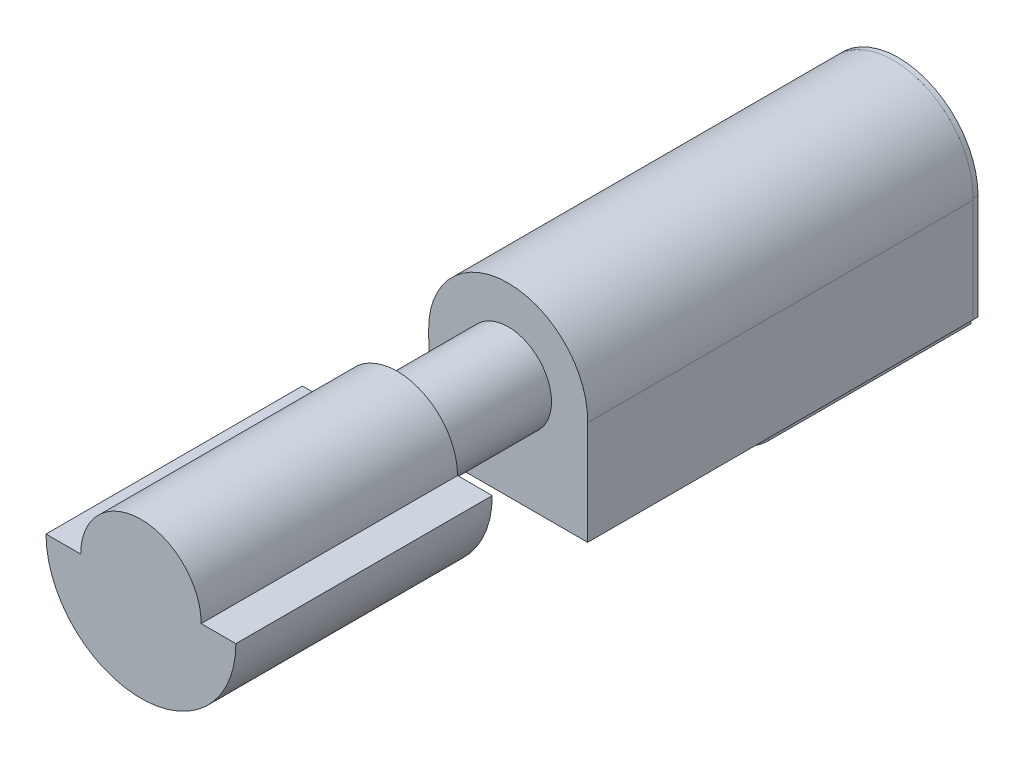
ISO-10303-21;
HEADER;
FILE_DESCRIPTION(('STEP AP214'),'2;1');
FILE_NAME('part.step','',(''),(''),'','','');
FILE_SCHEMA(('AUTOMOTIVE_DESIGN { 1 0 10303 214 1 1 1 1 }'));
ENDSEC;
DATA;
#1=APPLICATION_CONTEXT('core data for automotive mechanical design processes');
#2=APPLICATION_PROTOCOL_DEFINITION('international standard','automotive_design',2000,#1);
#3=PRODUCT_CONTEXT('',#1,'mechanical');
#4=PRODUCT('Part','Part','',(#3));
#5=PRODUCT_RELATED_PRODUCT_CATEGORY('part','',(#4));
#6=PRODUCT_DEFINITION_FORMATION('','',#4);
#7=PRODUCT_DEFINITION_CONTEXT('part definition',#1,'design');
#8=PRODUCT_DEFINITION('design','',#6,#7);
#9=PRODUCT_DEFINITION_SHAPE('','',#8);
#10=(LENGTH_UNIT() NAMED_UNIT(*) SI_UNIT(.MILLI.,.METRE.));
#11=(NAMED_UNIT(*) PLANE_ANGLE_UNIT() SI_UNIT($,.RADIAN.));
#12=(NAMED_UNIT(*) SI_UNIT($,.STERADIAN.) SOLID_ANGLE_UNIT());
#13=UNCERTAINTY_MEASURE_WITH_UNIT(LENGTH_MEASURE(1.E-05),#10,'distance_accuracy_value','');
#14=(GEOMETRIC_REPRESENTATION_CONTEXT(3) GLOBAL_UNCERTAINTY_ASSIGNED_CONTEXT((#13)) GLOBAL_UNIT_ASSIGNED_CONTEXT((#10,
#11,#12)) REPRESENTATION_CONTEXT('',''));
#15=CARTESIAN_POINT('',(0.,0.,0.));
#16=DIRECTION('',(0.,0.,1.));
#17=DIRECTION('',(1.,0.,0.));
#18=AXIS2_PLACEMENT_3D('',#15,#16,#17);
#19=CARTESIAN_POINT('',(0.,0.,0.));
#20=DIRECTION('',(0.,0.,1.));
#21=DIRECTION('',(1.,0.,0.));
#22=AXIS2_PLACEMENT_3D('',#19,#20,#21);
#23=PLANE('',#22);
#24=DIRECTION('',(-1.,0.,0.));
#25=VECTOR('',#24,1.);
#26=CARTESIAN_POINT('',(1.25,-2.15049334737199,0.));
#27=LINE('',#26,#25);
#28=CARTESIAN_POINT('',(1.6,-2.15049334737199,0.));
#29=VERTEX_POINT('',#28);
#30=CARTESIAN_POINT('',(1.25,-2.15049334737199,0.));
#31=VERTEX_POINT('',#30);
#32=EDGE_CURVE('E11',#29,#31,#27,.T.);
#33=ORIENTED_EDGE('',*,*,#32,.F.);
#34=DIRECTION('',(0.,-1.,0.));
#35=VECTOR('',#34,1.);
#36=CARTESIAN_POINT('',(1.6,-2.15049334737199,0.));
#37=LINE('',#36,#35);
#38=CARTESIAN_POINT('',(1.6,-2.25049334737199,0.));
#39=VERTEX_POINT('',#38);
#40=EDGE_CURVE('E430',#29,#39,#37,.T.);
#41=ORIENTED_EDGE('',*,*,#40,.T.);
#42=DIRECTION('',(1.,0.,0.));
#43=VECTOR('',#42,1.);
#44=CARTESIAN_POINT('',(1.6,-2.25049334737199,0.));
#45=LINE('',#44,#43);
#46=CARTESIAN_POINT('',(0.300000000000001,-2.25049334737199,0.));
#47=VERTEX_POINT('',#46);
#48=EDGE_CURVE('E876',#47,#39,#45,.T.);
#49=ORIENTED_EDGE('',*,*,#48,.F.);
#50=DIRECTION('',(0.,1.,0.));
#51=VECTOR('',#50,1.);
#52=CARTESIAN_POINT('',(0.300000000000001,-2.25049334737199,0.));
#53=LINE('',#52,#51);
#54=CARTESIAN_POINT('',(0.300000000000001,-2.15049334737199,0.));
#55=VERTEX_POINT('',#54);
#56=EDGE_CURVE('E880',#47,#55,#53,.T.);
#57=ORIENTED_EDGE('',*,*,#56,.T.);
#58=DIRECTION('',(-1.,0.,0.));
#59=VECTOR('',#58,1.);
#60=CARTESIAN_POINT('',(1.6,-2.15049334737199,0.));
#61=LINE('',#60,#59);
#62=CARTESIAN_POINT('',(-0.300000000000001,-2.15049334737199,0.));
#63=VERTEX_POINT('',#62);
#64=EDGE_CURVE('E422',#55,#63,#61,.T.);
#65=ORIENTED_EDGE('',*,*,#64,.T.);
#66=DIRECTION('',(0.,1.,0.));
#67=VECTOR('',#66,1.);
#68=CARTESIAN_POINT('',(-0.300000000000001,-2.25049334737199,0.));
#69=LINE('',#68,#67);
#70=CARTESIAN_POINT('',(-0.300000000000001,-2.25049334737199,0.));
#71=VERTEX_POINT('',#70);
#72=EDGE_CURVE('E854',#71,#63,#69,.T.);
#73=ORIENTED_EDGE('',*,*,#72,.F.);
#74=DIRECTION('',(1.,0.,0.));
#75=VECTOR('',#74,1.);
#76=CARTESIAN_POINT('',(-1.6,-2.25049334737199,0.));
#77=LINE('',#76,#75);
#78=CARTESIAN_POINT('',(-1.6,-2.25049334737199,0.));
#79=VERTEX_POINT('',#78);
#80=EDGE_CURVE('E415',#79,#71,#77,.T.);
#81=ORIENTED_EDGE('',*,*,#80,.F.);
#82=DIRECTION('',(0.,1.,0.));
#83=VECTOR('',#82,1.);
#84=CARTESIAN_POINT('',(-1.6,-2.15049334737199,0.));
#85=LINE('',#84,#83);
#86=CARTESIAN_POINT('',(-1.6,-2.15049334737199,0.));
#87=VERTEX_POINT('',#86);
#88=EDGE_CURVE('E413',#79,#87,#85,.T.);
#89=ORIENTED_EDGE('',*,*,#88,.T.);
#90=DIRECTION('',(-1.,0.,0.));
#91=VECTOR('',#90,1.);
#92=CARTESIAN_POINT('',(-1.6,-2.15049334737199,0.));
#93=LINE('',#92,#91);
#94=CARTESIAN_POINT('',(-1.25,-2.15049334737199,0.));
#95=VERTEX_POINT('',#94);
#96=EDGE_CURVE('E334',#95,#87,#93,.T.);
#97=ORIENTED_EDGE('',*,*,#96,.F.);
#98=DIRECTION('',(0.,-1.,0.));
#99=VECTOR('',#98,1.);
#100=CARTESIAN_POINT('',(-1.25,-2.15049334737199,0.));
#101=LINE('',#100,#99);
#102=CARTESIAN_POINT('',(-1.25,0.,0.));
#103=VERTEX_POINT('',#102);
#104=EDGE_CURVE('E405',#103,#95,#101,.T.);
#105=ORIENTED_EDGE('',*,*,#104,.F.);
#106=CARTESIAN_POINT('',(0.,0.,0.));
#107=DIRECTION('',(0.,0.,1.));
#108=DIRECTION('',(-1.,0.,0.));
#109=AXIS2_PLACEMENT_3D('',#106,#107,#108);
#110=CIRCLE('',#109,1.25);
#111=CARTESIAN_POINT('',(1.25,0.,0.));
#112=VERTEX_POINT('',#111);
#113=EDGE_CURVE('E64',#112,#103,#110,.T.);
#114=ORIENTED_EDGE('',*,*,#113,.F.);
#115=DIRECTION('',(0.,1.,0.));
#116=VECTOR('',#115,1.);
#117=CARTESIAN_POINT('',(1.25,0.,0.));
#118=LINE('',#117,#116);
#119=EDGE_CURVE('E60',#31,#112,#118,.T.);
#120=ORIENTED_EDGE('',*,*,#119,.F.);
#121=EDGE_LOOP('',(#33,#41,#49,#57,#65,#73,#81,#89,#97,#105,#114,#120));
#122=FACE_BOUND('',#121,.T.);
#123=ADVANCED_FACE('F41',(#122),#23,.F.);
#124=DIRECTION('',(-0.0232441969275777,0.999729817155211,0.));
#125=VECTOR('',#124,1.);
#126=CARTESIAN_POINT('',(-1.65,0.,0.));
#127=LINE('',#126,#125);
#128=CARTESIAN_POINT('',(-1.65,0.,0.));
#129=VERTEX_POINT('',#128);
#130=EDGE_CURVE('E328',#87,#129,#127,.T.);
#131=ORIENTED_EDGE('',*,*,#130,.F.);
#132=DIRECTION('',(-1.,0.,0.));
#133=VECTOR('',#132,1.);
#134=CARTESIAN_POINT('',(-1.61,-2.15049334737199,0.));
#135=LINE('',#134,#133);
#136=CARTESIAN_POINT('',(-1.61,-2.15049334737199,0.));
#137=VERTEX_POINT('',#136);
#138=EDGE_CURVE('E263',#87,#137,#135,.T.);
#139=ORIENTED_EDGE('',*,*,#138,.T.);
#140=DIRECTION('',(-0.0185971662543572,0.999827057749143,0.));
#141=VECTOR('',#140,1.);
#142=CARTESIAN_POINT('',(-1.61,-2.15049334737199,0.));
#143=LINE('',#142,#141);
#144=CARTESIAN_POINT('',(-1.64885867984412,-0.0613600350612654,0.));
#145=VERTEX_POINT('',#144);
#146=EDGE_CURVE('E266',#137,#145,#143,.T.);
#147=ORIENTED_EDGE('',*,*,#146,.T.);
#148=CARTESIAN_POINT('',(0.,0.,0.));
#149=DIRECTION('',(0.,0.,1.));
#150=DIRECTION('',(-1.,0.,0.));
#151=AXIS2_PLACEMENT_3D('',#148,#149,#150);
#152=CIRCLE('',#151,1.65);
#153=EDGE_CURVE('E427',#129,#145,#152,.T.);
#154=ORIENTED_EDGE('',*,*,#153,.F.);
#155=EDGE_LOOP('',(#131,#139,#147,#154));
#156=FACE_BOUND('',#155,.T.);
#157=ADVANCED_FACE('F450',(#156),#23,.F.);
#158=CARTESIAN_POINT('',(0.,0.,8.));
#159=DIRECTION('',(0.,0.,1.));
#160=DIRECTION('',(1.,0.,0.));
#161=AXIS2_PLACEMENT_3D('',#158,#159,#160);
#162=PLANE('',#161);
#163=CARTESIAN_POINT('',(0.,0.,8.));
#164=DIRECTION('',(0.,0.,1.));
#165=DIRECTION('',(1.,0.,0.));
#166=AXIS2_PLACEMENT_3D('',#163,#164,#165);
#167=CIRCLE('',#166,0.9);
#168=CARTESIAN_POINT('',(0.9,0.,8.));
#169=VERTEX_POINT('',#168);
#170=EDGE_CURVE('E421',#169,#169,#167,.T.);
#171=ORIENTED_EDGE('',*,*,#170,.F.);
#172=EDGE_LOOP('',(#171));
#173=FACE_BOUND('',#172,.T.);
#174=DIRECTION('',(0.,-1.,0.));
#175=VECTOR('',#174,1.);
#176=CARTESIAN_POINT('',(1.65,0.,8.));
#177=LINE('',#176,#175);
#178=CARTESIAN_POINT('',(1.65,0.,8.));
#179=VERTEX_POINT('',#178);
#180=CARTESIAN_POINT('',(1.65,-2.15049334737199,8.));
#181=VERTEX_POINT('',#180);
#182=EDGE_CURVE('E271',#179,#181,#177,.T.);
#183=ORIENTED_EDGE('',*,*,#182,.F.);
#184=CARTESIAN_POINT('',(0.,0.0361001669217735,8.));
#185=DIRECTION('',(0.,0.,1.));
#186=DIRECTION('',(1.,0.,0.));
#187=AXIS2_PLACEMENT_3D('',#184,#185,#186);
#188=CIRCLE('',#187,1.65039486852443);
#189=CARTESIAN_POINT('',(-1.65,0.,8.));
#190=VERTEX_POINT('',#189);
#191=EDGE_CURVE('E291',#190,#179,#188,.F.);
#192=ORIENTED_EDGE('',*,*,#191,.F.);
#193=CARTESIAN_POINT('',(-1.65,0.,8.));
#194=DIRECTION('',(0.0185971662543562,-0.999827057749143,0.));
#195=VECTOR('',#194,1.);
#196=LINE('',#193,#195);
#197=CARTESIAN_POINT('',(-1.64885867984412,-0.0613600350612645,8.));
#198=VERTEX_POINT('',#197);
#199=EDGE_CURVE('E52',#190,#198,#196,.T.);
#200=ORIENTED_EDGE('',*,*,#199,.T.);
#201=DIRECTION('',(-0.0185971662543572,0.999827057749143,0.));
#202=VECTOR('',#201,1.);
#203=CARTESIAN_POINT('',(-1.61,-2.15049334737199,8.));
#204=LINE('',#203,#202);
#205=CARTESIAN_POINT('',(-1.61,-2.15049334737199,8.));
#206=VERTEX_POINT('',#205);
#207=EDGE_CURVE('E284',#206,#198,#204,.T.);
#208=ORIENTED_EDGE('',*,*,#207,.F.);
#209=DIRECTION('',(-1.,0.,0.));
#210=VECTOR('',#209,1.);
#211=CARTESIAN_POINT('',(-1.61,-2.15049334737199,8.));
#212=LINE('',#211,#210);
#213=EDGE_CURVE('E276',#181,#206,#212,.T.);
#214=ORIENTED_EDGE('',*,*,#213,.F.);
#215=EDGE_LOOP('',(#183,#192,#200,#208,#214));
#216=FACE_BOUND('',#215,.T.);
#217=ADVANCED_FACE('F451',(#173,#216),#162,.T.);
#218=CARTESIAN_POINT('',(0.,0.,8.));
#219=DIRECTION('',(0.,0.,-1.));
#220=DIRECTION('',(-1.,0.,0.));
#221=AXIS2_PLACEMENT_3D('',#218,#219,#220);
#222=CYLINDRICAL_SURFACE('',#221,1.65);
#223=ORIENTED_EDGE('',*,*,#153,.T.);
#224=DIRECTION('',(0.,0.,-1.));
#225=VECTOR('',#224,1.);
#226=CARTESIAN_POINT('',(-1.64885867984412,-0.0613600350612513,8.));
#227=LINE('',#226,#225);
#228=EDGE_CURVE('E298',#145,#198,#227,.F.);
#229=ORIENTED_EDGE('',*,*,#228,.T.);
#230=ORIENTED_EDGE('',*,*,#199,.F.);
#231=DIRECTION('',(0.,0.,-1.));
#232=VECTOR('',#231,1.);
#233=CARTESIAN_POINT('',(-1.65,0.,13.0613923714813));
#234=LINE('',#233,#232);
#235=EDGE_CURVE('E310',#190,#129,#234,.T.);
#236=ORIENTED_EDGE('',*,*,#235,.T.);
#237=EDGE_LOOP('',(#223,#229,#230,#236));
#238=FACE_BOUND('',#237,.T.);
#239=ADVANCED_FACE('F43',(#238),#222,.T.);
#240=CARTESIAN_POINT('',(1.6,-2.15049334737199,4.2));
#241=DIRECTION('',(1.,0.,0.));
#242=DIRECTION('',(0.,0.,-1.));
#243=AXIS2_PLACEMENT_3D('',#240,#241,#242);
#244=PLANE('',#243);
#245=DIRECTION('',(0.,0.,-1.));
#246=VECTOR('',#245,1.);
#247=CARTESIAN_POINT('',(1.6,-2.15049334737199,4.2));
#248=LINE('',#247,#246);
#249=CARTESIAN_POINT('',(1.6,-2.15049334737199,4.2));
#250=VERTEX_POINT('',#249);
#251=EDGE_CURVE('E290',#250,#29,#248,.T.);
#252=ORIENTED_EDGE('',*,*,#251,.F.);
#253=DIRECTION('',(0.,1.,0.));
#254=VECTOR('',#253,1.);
#255=CARTESIAN_POINT('',(1.6,-2.25049334737199,4.2));
#256=LINE('',#255,#254);
#257=CARTESIAN_POINT('',(1.6,-2.25049334737199,4.2));
#258=VERTEX_POINT('',#257);
#259=EDGE_CURVE('E910',#258,#250,#256,.T.);
#260=ORIENTED_EDGE('',*,*,#259,.F.);
#261=DIRECTION('',(0.,0.,1.));
#262=VECTOR('',#261,1.);
#263=CARTESIAN_POINT('',(1.6,-2.25049334737199,0.));
#264=LINE('',#263,#262);
#265=EDGE_CURVE('E859',#39,#258,#264,.T.);
#266=ORIENTED_EDGE('',*,*,#265,.F.);
#267=ORIENTED_EDGE('',*,*,#40,.F.);
#268=EDGE_LOOP('',(#252,#260,#266,#267));
#269=FACE_BOUND('',#268,.T.);
#270=ADVANCED_FACE('F456',(#269),#244,.T.);
#271=CARTESIAN_POINT('',(-1.6,-2.15049334737199,4.2));
#272=DIRECTION('',(-1.,0.,0.));
#273=DIRECTION('',(0.,0.,1.));
#274=AXIS2_PLACEMENT_3D('',#271,#272,#273);
#275=PLANE('',#274);
#276=DIRECTION('',(0.,0.,1.));
#277=VECTOR('',#276,1.);
#278=CARTESIAN_POINT('',(-1.6,-2.15049334737199,4.2));
#279=LINE('',#278,#277);
#280=CARTESIAN_POINT('',(-1.6,-2.15049334737199,4.2));
#281=VERTEX_POINT('',#280);
#282=EDGE_CURVE('E295',#87,#281,#279,.T.);
#283=ORIENTED_EDGE('',*,*,#282,.F.);
#284=ORIENTED_EDGE('',*,*,#88,.F.);
#285=DIRECTION('',(0.,0.,-1.));
#286=VECTOR('',#285,1.);
#287=CARTESIAN_POINT('',(-1.6,-2.25049334737199,0.));
#288=LINE('',#287,#286);
#289=CARTESIAN_POINT('',(-1.6,-2.25049334737199,4.2));
#290=VERTEX_POINT('',#289);
#291=EDGE_CURVE('E830',#290,#79,#288,.T.);
#292=ORIENTED_EDGE('',*,*,#291,.F.);
#293=DIRECTION('',(0.,1.,0.));
#294=VECTOR('',#293,1.);
#295=CARTESIAN_POINT('',(-1.6,-2.25049334737199,4.2));
#296=LINE('',#295,#294);
#297=EDGE_CURVE('E829',#290,#281,#296,.T.);
#298=ORIENTED_EDGE('',*,*,#297,.T.);
#299=EDGE_LOOP('',(#283,#284,#292,#298));
#300=FACE_BOUND('',#299,.T.);
#301=ADVANCED_FACE('F564',(#300),#275,.T.);
#302=CARTESIAN_POINT('',(1.6,-2.15049334737199,4.2));
#303=DIRECTION('',(0.,-1.,0.));
#304=DIRECTION('',(0.,0.,-1.));
#305=AXIS2_PLACEMENT_3D('',#302,#303,#304);
#306=PLANE('',#305);
#307=DIRECTION('',(0.,0.,-1.));
#308=VECTOR('',#307,1.);
#309=CARTESIAN_POINT('',(0.300000000000001,-2.15049334737199,0.));
#310=LINE('',#309,#308);
#311=CARTESIAN_POINT('',(0.300000000000001,-2.15049334737199,4.2));
#312=VERTEX_POINT('',#311);
#313=EDGE_CURVE('E864',#312,#55,#310,.T.);
#314=ORIENTED_EDGE('',*,*,#313,.F.);
#315=CARTESIAN_POINT('',(0.8,-2.15049334737199,4.2));
#316=DIRECTION('',(0.,-1.,0.));
#317=DIRECTION('',(0.,0.,-1.));
#318=AXIS2_PLACEMENT_3D('',#315,#316,#317);
#319=CIRCLE('',#318,0.5);
#320=CARTESIAN_POINT('',(0.800000000000004,-2.15049334737199,4.7));
#321=VERTEX_POINT('',#320);
#322=EDGE_CURVE('E888',#321,#312,#319,.T.);
#323=ORIENTED_EDGE('',*,*,#322,.F.);
#324=DIRECTION('',(-1.,0.,0.));
#325=VECTOR('',#324,1.);
#326=CARTESIAN_POINT('',(1.1,-2.15049334737199,4.7));
#327=LINE('',#326,#325);
#328=CARTESIAN_POINT('',(1.1,-2.15049334737199,4.7));
#329=VERTEX_POINT('',#328);
#330=EDGE_CURVE('E884',#329,#321,#327,.T.);
#331=ORIENTED_EDGE('',*,*,#330,.F.);
#332=CARTESIAN_POINT('',(1.1,-2.15049334737199,4.2));
#333=DIRECTION('',(0.,-1.,0.));
#334=DIRECTION('',(0.,0.,-1.));
#335=AXIS2_PLACEMENT_3D('',#332,#333,#334);
#336=CIRCLE('',#335,0.5);
#337=EDGE_CURVE('E858',#250,#329,#336,.T.);
#338=ORIENTED_EDGE('',*,*,#337,.F.);
#339=ORIENTED_EDGE('',*,*,#251,.T.);
#340=ORIENTED_EDGE('',*,*,#32,.T.);
#341=DIRECTION('',(0.,0.,1.));
#342=VECTOR('',#341,1.);
#343=CARTESIAN_POINT('',(1.25,-2.15049334737199,-0.1));
#344=LINE('',#343,#342);
#345=CARTESIAN_POINT('',(1.25,-2.15049334737199,-0.1));
#346=VERTEX_POINT('',#345);
#347=EDGE_CURVE('E351',#346,#31,#344,.T.);
#348=ORIENTED_EDGE('',*,*,#347,.F.);
#349=DIRECTION('',(-1.,0.,0.));
#350=VECTOR('',#349,1.);
#351=CARTESIAN_POINT('',(1.25,-2.15049334737199,-0.1));
#352=LINE('',#351,#350);
#353=CARTESIAN_POINT('',(1.65,-2.15049334737199,-0.1));
#354=VERTEX_POINT('',#353);
#355=EDGE_CURVE('E394',#354,#346,#352,.T.);
#356=ORIENTED_EDGE('',*,*,#355,.F.);
#357=DIRECTION('',(0.,0.,1.));
#358=VECTOR('',#357,1.);
#359=CARTESIAN_POINT('',(1.65,-2.15049334737199,-0.1));
#360=LINE('',#359,#358);
#361=CARTESIAN_POINT('',(1.65,-2.15049334737199,0.));
#362=VERTEX_POINT('',#361);
#363=EDGE_CURVE('E355',#354,#362,#360,.T.);
#364=ORIENTED_EDGE('',*,*,#363,.T.);
#365=DIRECTION('',(0.,0.,-1.));
#366=VECTOR('',#365,1.);
#367=CARTESIAN_POINT('',(1.65,-2.15049334737199,13.0613923714813));
#368=LINE('',#367,#366);
#369=EDGE_CURVE('E275',#181,#362,#368,.T.);
#370=ORIENTED_EDGE('',*,*,#369,.F.);
#371=ORIENTED_EDGE('',*,*,#213,.T.);
#372=DIRECTION('',(0.,0.,-1.));
#373=VECTOR('',#372,1.);
#374=CARTESIAN_POINT('',(-1.61,-2.15049334737199,13.0613923714813));
#375=LINE('',#374,#373);
#376=EDGE_CURVE('E280',#206,#137,#375,.T.);
#377=ORIENTED_EDGE('',*,*,#376,.T.);
#378=ORIENTED_EDGE('',*,*,#138,.F.);
#379=ORIENTED_EDGE('',*,*,#282,.T.);
#380=CARTESIAN_POINT('',(-1.1,-2.15049334737199,4.2));
#381=DIRECTION('',(0.,-1.,0.));
#382=DIRECTION('',(0.,0.,1.));
#383=AXIS2_PLACEMENT_3D('',#380,#381,#382);
#384=CIRCLE('',#383,0.5);
#385=CARTESIAN_POINT('',(-1.1,-2.15049334737199,4.7));
#386=VERTEX_POINT('',#385);
#387=EDGE_CURVE('E844',#386,#281,#384,.T.);
#388=ORIENTED_EDGE('',*,*,#387,.F.);
#389=DIRECTION('',(-1.,0.,0.));
#390=VECTOR('',#389,1.);
#391=CARTESIAN_POINT('',(-1.1,-2.15049334737199,4.7));
#392=LINE('',#391,#390);
#393=CARTESIAN_POINT('',(-0.800000000000004,-2.15049334737199,4.7));
#394=VERTEX_POINT('',#393);
#395=EDGE_CURVE('E995',#394,#386,#392,.T.);
#396=ORIENTED_EDGE('',*,*,#395,.F.);
#397=CARTESIAN_POINT('',(-0.8,-2.15049334737199,4.2));
#398=DIRECTION('',(0.,-1.,0.));
#399=DIRECTION('',(0.,0.,1.));
#400=AXIS2_PLACEMENT_3D('',#397,#398,#399);
#401=CIRCLE('',#400,0.5);
#402=CARTESIAN_POINT('',(-0.300000000000001,-2.15049334737199,4.2));
#403=VERTEX_POINT('',#402);
#404=EDGE_CURVE('E992',#403,#394,#401,.T.);
#405=ORIENTED_EDGE('',*,*,#404,.F.);
#406=DIRECTION('',(0.,0.,1.));
#407=VECTOR('',#406,1.);
#408=CARTESIAN_POINT('',(-0.300000000000001,-2.15049334737199,0.));
#409=LINE('',#408,#407);
#410=EDGE_CURVE('E304',#63,#403,#409,.T.);
#411=ORIENTED_EDGE('',*,*,#410,.F.);
#412=ORIENTED_EDGE('',*,*,#64,.F.);
#413=EDGE_LOOP('',(#314,#323,#331,#338,#339,#340,#348,#356,#364,#370,#371,#377,#378,#379,#388,
#396,#405,#411,#412));
#414=FACE_BOUND('',#413,.T.);
#415=ADVANCED_FACE('F392',(#414),#306,.T.);
#416=CARTESIAN_POINT('',(0.,0.,10.3));
#417=DIRECTION('',(0.,0.,-1.));
#418=DIRECTION('',(-1.,0.,0.));
#419=AXIS2_PLACEMENT_3D('',#416,#417,#418);
#420=CYLINDRICAL_SURFACE('',#419,0.9);
#421=CARTESIAN_POINT('',(0.,0.,10.3));
#422=DIRECTION('',(0.,0.,1.));
#423=DIRECTION('',(1.,0.,0.));
#424=AXIS2_PLACEMENT_3D('',#421,#422,#423);
#425=CIRCLE('',#424,0.9);
#426=CARTESIAN_POINT('',(0.9,0.,10.3));
#427=VERTEX_POINT('',#426);
#428=EDGE_CURVE('E955',#427,#427,#425,.T.);
#429=ORIENTED_EDGE('',*,*,#428,.F.);
#430=EDGE_LOOP('',(#429));
#431=FACE_BOUND('',#430,.T.);
#432=ORIENTED_EDGE('',*,*,#170,.T.);
#433=EDGE_LOOP('',(#432));
#434=FACE_BOUND('',#433,.T.);
#435=ADVANCED_FACE('F559',(#431,#434),#420,.T.);
#436=CARTESIAN_POINT('',(0.,0.,15.62));
#437=DIRECTION('',(0.,0.,-1.));
#438=DIRECTION('',(-1.,0.,0.));
#439=AXIS2_PLACEMENT_3D('',#436,#437,#438);
#440=CYLINDRICAL_SURFACE('',#439,1.97);
#441=CARTESIAN_POINT('',(0.,0.,10.3));
#442=DIRECTION('',(0.,0.,1.));
#443=DIRECTION('',(1.,0.,0.));
#444=AXIS2_PLACEMENT_3D('',#441,#442,#443);
#445=CIRCLE('',#444,1.97);
#446=CARTESIAN_POINT('',(-1.97,0.,10.3));
#447=VERTEX_POINT('',#446);
#448=CARTESIAN_POINT('',(1.97,0.,10.3));
#449=VERTEX_POINT('',#448);
#450=EDGE_CURVE('E942',#447,#449,#445,.T.);
#451=ORIENTED_EDGE('',*,*,#450,.T.);
#452=DIRECTION('',(0.,0.,1.));
#453=VECTOR('',#452,1.);
#454=CARTESIAN_POINT('',(1.97,0.,10.3));
#455=LINE('',#454,#453);
#456=CARTESIAN_POINT('',(1.97,0.,15.62));
#457=VERTEX_POINT('',#456);
#458=EDGE_CURVE('E938',#449,#457,#455,.T.);
#459=ORIENTED_EDGE('',*,*,#458,.T.);
#460=CARTESIAN_POINT('',(0.,0.,15.62));
#461=DIRECTION('',(0.,0.,1.));
#462=DIRECTION('',(1.,0.,0.));
#463=AXIS2_PLACEMENT_3D('',#460,#461,#462);
#464=CIRCLE('',#463,1.97);
#465=CARTESIAN_POINT('',(-1.97,0.,15.62));
#466=VERTEX_POINT('',#465);
#467=EDGE_CURVE('E951',#466,#457,#464,.T.);
#468=ORIENTED_EDGE('',*,*,#467,.F.);
#469=DIRECTION('',(0.,0.,1.));
#470=VECTOR('',#469,1.);
#471=CARTESIAN_POINT('',(-1.97,0.,10.3));
#472=LINE('',#471,#470);
#473=EDGE_CURVE('E928',#447,#466,#472,.T.);
#474=ORIENTED_EDGE('',*,*,#473,.F.);
#475=EDGE_LOOP('',(#451,#459,#468,#474));
#476=FACE_BOUND('',#475,.T.);
#477=ADVANCED_FACE('F552',(#476),#440,.T.);
#478=CARTESIAN_POINT('',(0.,0.,15.62));
#479=DIRECTION('',(0.,0.,1.));
#480=DIRECTION('',(1.,0.,0.));
#481=AXIS2_PLACEMENT_3D('',#478,#479,#480);
#482=PLANE('',#481);
#483=DIRECTION('',(1.,0.,0.));
#484=VECTOR('',#483,1.);
#485=CARTESIAN_POINT('',(1.25,0.,15.62));
#486=LINE('',#485,#484);
#487=CARTESIAN_POINT('',(1.25,0.,15.62));
#488=VERTEX_POINT('',#487);
#489=EDGE_CURVE('E920',#488,#457,#486,.T.);
#490=ORIENTED_EDGE('',*,*,#489,.F.);
#491=CARTESIAN_POINT('',(0.,0.,15.62));
#492=DIRECTION('',(0.,0.,-1.));
#493=DIRECTION('',(-1.,0.,0.));
#494=AXIS2_PLACEMENT_3D('',#491,#492,#493);
#495=CIRCLE('',#494,1.25);
#496=CARTESIAN_POINT('',(-1.25,0.,15.62));
#497=VERTEX_POINT('',#496);
#498=EDGE_CURVE('E932',#497,#488,#495,.T.);
#499=ORIENTED_EDGE('',*,*,#498,.F.);
#500=DIRECTION('',(1.,0.,0.));
#501=VECTOR('',#500,1.);
#502=CARTESIAN_POINT('',(-1.97,0.,15.62));
#503=LINE('',#502,#501);
#504=EDGE_CURVE('E914',#466,#497,#503,.T.);
#505=ORIENTED_EDGE('',*,*,#504,.F.);
#506=ORIENTED_EDGE('',*,*,#467,.T.);
#507=EDGE_LOOP('',(#490,#499,#505,#506));
#508=FACE_BOUND('',#507,.T.);
#509=ADVANCED_FACE('F549',(#508),#482,.T.);
#510=CARTESIAN_POINT('',(0.,0.,10.3));
#511=DIRECTION('',(0.,0.,1.));
#512=DIRECTION('',(1.,0.,0.));
#513=AXIS2_PLACEMENT_3D('',#510,#511,#512);
#514=PLANE('',#513);
#515=ORIENTED_EDGE('',*,*,#428,.T.);
#516=EDGE_LOOP('',(#515));
#517=FACE_BOUND('',#516,.T.);
#518=CARTESIAN_POINT('',(0.,0.,10.3));
#519=DIRECTION('',(0.,0.,-1.));
#520=DIRECTION('',(-1.,0.,0.));
#521=AXIS2_PLACEMENT_3D('',#518,#519,#520);
#522=CIRCLE('',#521,1.25);
#523=CARTESIAN_POINT('',(-1.25,0.,10.3));
#524=VERTEX_POINT('',#523);
#525=CARTESIAN_POINT('',(1.25,0.,10.3));
#526=VERTEX_POINT('',#525);
#527=EDGE_CURVE('E919',#524,#526,#522,.T.);
#528=ORIENTED_EDGE('',*,*,#527,.T.);
#529=DIRECTION('',(1.,0.,0.));
#530=VECTOR('',#529,1.);
#531=CARTESIAN_POINT('',(1.25,0.,10.3));
#532=LINE('',#531,#530);
#533=EDGE_CURVE('E924',#526,#449,#532,.T.);
#534=ORIENTED_EDGE('',*,*,#533,.T.);
#535=ORIENTED_EDGE('',*,*,#450,.F.);
#536=DIRECTION('',(1.,0.,0.));
#537=VECTOR('',#536,1.);
#538=CARTESIAN_POINT('',(-1.97,0.,10.3));
#539=LINE('',#538,#537);
#540=EDGE_CURVE('E915',#447,#524,#539,.T.);
#541=ORIENTED_EDGE('',*,*,#540,.T.);
#542=EDGE_LOOP('',(#528,#534,#535,#541));
#543=FACE_BOUND('',#542,.T.);
#544=ADVANCED_FACE('F541',(#517,#543),#514,.F.);
#545=CARTESIAN_POINT('',(1.25,0.,10.3));
#546=DIRECTION('',(0.,-1.,0.));
#547=DIRECTION('',(0.,0.,-1.));
#548=AXIS2_PLACEMENT_3D('',#545,#546,#547);
#549=PLANE('',#548);
#550=ORIENTED_EDGE('',*,*,#489,.T.);
#551=ORIENTED_EDGE('',*,*,#458,.F.);
#552=ORIENTED_EDGE('',*,*,#533,.F.);
#553=DIRECTION('',(0.,0.,1.));
#554=VECTOR('',#553,1.);
#555=CARTESIAN_POINT('',(1.25,0.,10.3));
#556=LINE('',#555,#554);
#557=EDGE_CURVE('E943',#526,#488,#556,.T.);
#558=ORIENTED_EDGE('',*,*,#557,.T.);
#559=EDGE_LOOP('',(#550,#551,#552,#558));
#560=FACE_BOUND('',#559,.T.);
#561=ADVANCED_FACE('F537',(#560),#549,.F.);
#562=CARTESIAN_POINT('',(0.,0.,10.3));
#563=DIRECTION('',(0.,0.,1.));
#564=DIRECTION('',(1.,0.,0.));
#565=AXIS2_PLACEMENT_3D('',#562,#563,#564);
#566=CYLINDRICAL_SURFACE('',#565,1.25);
#567=ORIENTED_EDGE('',*,*,#498,.T.);
#568=ORIENTED_EDGE('',*,*,#557,.F.);
#569=ORIENTED_EDGE('',*,*,#527,.F.);
#570=DIRECTION('',(0.,0.,1.));
#571=VECTOR('',#570,1.);
#572=CARTESIAN_POINT('',(-1.25,0.,10.3));
#573=LINE('',#572,#571);
#574=EDGE_CURVE('E946',#524,#497,#573,.T.);
#575=ORIENTED_EDGE('',*,*,#574,.T.);
#576=EDGE_LOOP('',(#567,#568,#569,#575));
#577=FACE_BOUND('',#576,.T.);
#578=ADVANCED_FACE('F540',(#577),#566,.T.);
#579=CARTESIAN_POINT('',(-1.97,0.,10.3));
#580=DIRECTION('',(0.,-1.,0.));
#581=DIRECTION('',(0.,0.,-1.));
#582=AXIS2_PLACEMENT_3D('',#579,#580,#581);
#583=PLANE('',#582);
#584=ORIENTED_EDGE('',*,*,#504,.T.);
#585=ORIENTED_EDGE('',*,*,#574,.F.);
#586=ORIENTED_EDGE('',*,*,#540,.F.);
#587=ORIENTED_EDGE('',*,*,#473,.T.);
#588=EDGE_LOOP('',(#584,#585,#586,#587));
#589=FACE_BOUND('',#588,.T.);
#590=ADVANCED_FACE('F535',(#589),#583,.F.);
#591=CARTESIAN_POINT('',(1.1,-2.25049334737199,4.2));
#592=DIRECTION('',(0.,1.,0.));
#593=DIRECTION('',(0.,0.,1.));
#594=AXIS2_PLACEMENT_3D('',#591,#592,#593);
#595=CYLINDRICAL_SURFACE('',#594,0.5);
#596=ORIENTED_EDGE('',*,*,#337,.T.);
#597=DIRECTION('',(0.,1.,0.));
#598=VECTOR('',#597,1.);
#599=CARTESIAN_POINT('',(1.1,-2.25049334737199,4.7));
#600=LINE('',#599,#598);
#601=CARTESIAN_POINT('',(1.1,-2.25049334737199,4.7));
#602=VERTEX_POINT('',#601);
#603=EDGE_CURVE('E906',#602,#329,#600,.T.);
#604=ORIENTED_EDGE('',*,*,#603,.F.);
#605=CARTESIAN_POINT('',(1.1,-2.25049334737199,4.2));
#606=DIRECTION('',(0.,-1.,0.));
#607=DIRECTION('',(0.,0.,-1.));
#608=AXIS2_PLACEMENT_3D('',#605,#606,#607);
#609=CIRCLE('',#608,0.5);
#610=EDGE_CURVE('E863',#258,#602,#609,.T.);
#611=ORIENTED_EDGE('',*,*,#610,.F.);
#612=ORIENTED_EDGE('',*,*,#259,.T.);
#613=EDGE_LOOP('',(#596,#604,#611,#612));
#614=FACE_BOUND('',#613,.T.);
#615=ADVANCED_FACE('F531',(#614),#595,.T.);
#616=CARTESIAN_POINT('',(1.1,-2.25049334737199,4.7));
#617=DIRECTION('',(0.,0.,-1.));
#618=DIRECTION('',(-1.,0.,0.));
#619=AXIS2_PLACEMENT_3D('',#616,#617,#618);
#620=PLANE('',#619);
#621=ORIENTED_EDGE('',*,*,#330,.T.);
#622=DIRECTION('',(0.,1.,0.));
#623=VECTOR('',#622,1.);
#624=CARTESIAN_POINT('',(0.800000000000004,-2.25049334737199,4.7));
#625=LINE('',#624,#623);
#626=CARTESIAN_POINT('',(0.800000000000004,-2.25049334737199,4.7));
#627=VERTEX_POINT('',#626);
#628=EDGE_CURVE('E902',#627,#321,#625,.T.);
#629=ORIENTED_EDGE('',*,*,#628,.F.);
#630=DIRECTION('',(-1.,0.,0.));
#631=VECTOR('',#630,1.);
#632=CARTESIAN_POINT('',(1.1,-2.25049334737199,4.7));
#633=LINE('',#632,#631);
#634=EDGE_CURVE('E867',#602,#627,#633,.T.);
#635=ORIENTED_EDGE('',*,*,#634,.F.);
#636=ORIENTED_EDGE('',*,*,#603,.T.);
#637=EDGE_LOOP('',(#621,#629,#635,#636));
#638=FACE_BOUND('',#637,.T.);
#639=ADVANCED_FACE('F527',(#638),#620,.F.);
#640=CARTESIAN_POINT('',(0.8,-2.25049334737199,4.2));
#641=DIRECTION('',(0.,1.,0.));
#642=DIRECTION('',(0.,0.,1.));
#643=AXIS2_PLACEMENT_3D('',#640,#641,#642);
#644=CYLINDRICAL_SURFACE('',#643,0.5);
#645=ORIENTED_EDGE('',*,*,#322,.T.);
#646=DIRECTION('',(0.,1.,0.));
#647=VECTOR('',#646,1.);
#648=CARTESIAN_POINT('',(0.300000000000001,-2.25049334737199,4.2));
#649=LINE('',#648,#647);
#650=CARTESIAN_POINT('',(0.300000000000001,-2.25049334737199,4.2));
#651=VERTEX_POINT('',#650);
#652=EDGE_CURVE('E898',#651,#312,#649,.T.);
#653=ORIENTED_EDGE('',*,*,#652,.F.);
#654=CARTESIAN_POINT('',(0.8,-2.25049334737199,4.2));
#655=DIRECTION('',(0.,-1.,0.));
#656=DIRECTION('',(0.,0.,-1.));
#657=AXIS2_PLACEMENT_3D('',#654,#655,#656);
#658=CIRCLE('',#657,0.5);
#659=EDGE_CURVE('E870',#627,#651,#658,.T.);
#660=ORIENTED_EDGE('',*,*,#659,.F.);
#661=ORIENTED_EDGE('',*,*,#628,.T.);
#662=EDGE_LOOP('',(#645,#653,#660,#661));
#663=FACE_BOUND('',#662,.T.);
#664=ADVANCED_FACE('F523',(#663),#644,.T.);
#665=CARTESIAN_POINT('',(0.300000000000001,-2.25049334737199,0.));
#666=DIRECTION('',(1.,0.,0.));
#667=DIRECTION('',(0.,0.,-1.));
#668=AXIS2_PLACEMENT_3D('',#665,#666,#667);
#669=PLANE('',#668);
#670=ORIENTED_EDGE('',*,*,#313,.T.);
#671=ORIENTED_EDGE('',*,*,#56,.F.);
#672=DIRECTION('',(0.,0.,-1.));
#673=VECTOR('',#672,1.);
#674=CARTESIAN_POINT('',(0.300000000000001,-2.25049334737199,0.));
#675=LINE('',#674,#673);
#676=EDGE_CURVE('E873',#651,#47,#675,.T.);
#677=ORIENTED_EDGE('',*,*,#676,.F.);
#678=ORIENTED_EDGE('',*,*,#652,.T.);
#679=EDGE_LOOP('',(#670,#671,#677,#678));
#680=FACE_BOUND('',#679,.T.);
#681=ADVANCED_FACE('F519',(#680),#669,.F.);
#682=CARTESIAN_POINT('',(1.1,-2.25049334737199,4.2));
#683=DIRECTION('',(0.,-1.,0.));
#684=DIRECTION('',(0.,0.,-1.));
#685=AXIS2_PLACEMENT_3D('',#682,#683,#684);
#686=PLANE('',#685);
#687=ORIENTED_EDGE('',*,*,#265,.T.);
#688=ORIENTED_EDGE('',*,*,#610,.T.);
#689=ORIENTED_EDGE('',*,*,#634,.T.);
#690=ORIENTED_EDGE('',*,*,#659,.T.);
#691=ORIENTED_EDGE('',*,*,#676,.T.);
#692=ORIENTED_EDGE('',*,*,#48,.T.);
#693=EDGE_LOOP('',(#687,#688,#689,#690,#691,#692));
#694=FACE_BOUND('',#693,.T.);
#695=ADVANCED_FACE('F515',(#694),#686,.T.);
#696=CARTESIAN_POINT('',(-0.300000000000001,-2.25049334737199,0.));
#697=DIRECTION('',(-1.,0.,0.));
#698=DIRECTION('',(0.,0.,1.));
#699=AXIS2_PLACEMENT_3D('',#696,#697,#698);
#700=PLANE('',#699);
#701=ORIENTED_EDGE('',*,*,#410,.T.);
#702=DIRECTION('',(0.,1.,0.));
#703=VECTOR('',#702,1.);
#704=CARTESIAN_POINT('',(-0.300000000000001,-2.25049334737199,4.2));
#705=LINE('',#704,#703);
#706=CARTESIAN_POINT('',(-0.300000000000001,-2.25049334737199,4.2));
#707=VERTEX_POINT('',#706);
#708=EDGE_CURVE('E850',#707,#403,#705,.T.);
#709=ORIENTED_EDGE('',*,*,#708,.F.);
#710=DIRECTION('',(0.,0.,1.));
#711=VECTOR('',#710,1.);
#712=CARTESIAN_POINT('',(-0.300000000000001,-2.25049334737199,0.));
#713=LINE('',#712,#711);
#714=EDGE_CURVE('E977',#71,#707,#713,.T.);
#715=ORIENTED_EDGE('',*,*,#714,.F.);
#716=ORIENTED_EDGE('',*,*,#72,.T.);
#717=EDGE_LOOP('',(#701,#709,#715,#716));
#718=FACE_BOUND('',#717,.T.);
#719=ADVANCED_FACE('F511',(#718),#700,.F.);
#720=CARTESIAN_POINT('',(-0.8,-2.25049334737199,4.2));
#721=DIRECTION('',(0.,1.,0.));
#722=DIRECTION('',(0.,0.,1.));
#723=AXIS2_PLACEMENT_3D('',#720,#721,#722);
#724=CYLINDRICAL_SURFACE('',#723,0.5);
#725=ORIENTED_EDGE('',*,*,#404,.T.);
#726=DIRECTION('',(0.,1.,0.));
#727=VECTOR('',#726,1.);
#728=CARTESIAN_POINT('',(-0.800000000000004,-2.25049334737199,4.7));
#729=LINE('',#728,#727);
#730=CARTESIAN_POINT('',(-0.800000000000004,-2.25049334737199,4.7));
#731=VERTEX_POINT('',#730);
#732=EDGE_CURVE('E839',#731,#394,#729,.T.);
#733=ORIENTED_EDGE('',*,*,#732,.F.);
#734=CARTESIAN_POINT('',(-0.8,-2.25049334737199,4.2));
#735=DIRECTION('',(0.,-1.,0.));
#736=DIRECTION('',(0.,0.,1.));
#737=AXIS2_PLACEMENT_3D('',#734,#735,#736);
#738=CIRCLE('',#737,0.5);
#739=EDGE_CURVE('E980',#707,#731,#738,.T.);
#740=ORIENTED_EDGE('',*,*,#739,.F.);
#741=ORIENTED_EDGE('',*,*,#708,.T.);
#742=EDGE_LOOP('',(#725,#733,#740,#741));
#743=FACE_BOUND('',#742,.T.);
#744=ADVANCED_FACE('F507',(#743),#724,.T.);
#745=CARTESIAN_POINT('',(-1.1,-2.25049334737199,4.7));
#746=DIRECTION('',(0.,0.,-1.));
#747=DIRECTION('',(-1.,0.,0.));
#748=AXIS2_PLACEMENT_3D('',#745,#746,#747);
#749=PLANE('',#748);
#750=ORIENTED_EDGE('',*,*,#395,.T.);
#751=DIRECTION('',(0.,1.,0.));
#752=VECTOR('',#751,1.);
#753=CARTESIAN_POINT('',(-1.1,-2.25049334737199,4.7));
#754=LINE('',#753,#752);
#755=CARTESIAN_POINT('',(-1.1,-2.25049334737199,4.7));
#756=VERTEX_POINT('',#755);
#757=EDGE_CURVE('E833',#756,#386,#754,.T.);
#758=ORIENTED_EDGE('',*,*,#757,.F.);
#759=DIRECTION('',(-1.,0.,0.));
#760=VECTOR('',#759,1.);
#761=CARTESIAN_POINT('',(-1.1,-2.25049334737199,4.7));
#762=LINE('',#761,#760);
#763=EDGE_CURVE('E841',#731,#756,#762,.T.);
#764=ORIENTED_EDGE('',*,*,#763,.F.);
#765=ORIENTED_EDGE('',*,*,#732,.T.);
#766=EDGE_LOOP('',(#750,#758,#764,#765));
#767=FACE_BOUND('',#766,.T.);
#768=ADVANCED_FACE('F503',(#767),#749,.F.);
#769=CARTESIAN_POINT('',(-1.1,-2.25049334737199,4.2));
#770=DIRECTION('',(0.,1.,0.));
#771=DIRECTION('',(0.,0.,1.));
#772=AXIS2_PLACEMENT_3D('',#769,#770,#771);
#773=CYLINDRICAL_SURFACE('',#772,0.5);
#774=ORIENTED_EDGE('',*,*,#387,.T.);
#775=ORIENTED_EDGE('',*,*,#297,.F.);
#776=CARTESIAN_POINT('',(-1.1,-2.25049334737199,4.2));
#777=DIRECTION('',(0.,-1.,0.));
#778=DIRECTION('',(0.,0.,1.));
#779=AXIS2_PLACEMENT_3D('',#776,#777,#778);
#780=CIRCLE('',#779,0.5);
#781=EDGE_CURVE('E834',#756,#290,#780,.T.);
#782=ORIENTED_EDGE('',*,*,#781,.F.);
#783=ORIENTED_EDGE('',*,*,#757,.T.);
#784=EDGE_LOOP('',(#774,#775,#782,#783));
#785=FACE_BOUND('',#784,.T.);
#786=ADVANCED_FACE('F499',(#785),#773,.T.);
#787=CARTESIAN_POINT('',(-1.1,-2.25049334737199,4.2));
#788=DIRECTION('',(0.,1.,0.));
#789=DIRECTION('',(0.,0.,1.));
#790=AXIS2_PLACEMENT_3D('',#787,#788,#789);
#791=PLANE('',#790);
#792=ORIENTED_EDGE('',*,*,#291,.T.);
#793=ORIENTED_EDGE('',*,*,#80,.T.);
#794=ORIENTED_EDGE('',*,*,#714,.T.);
#795=ORIENTED_EDGE('',*,*,#739,.T.);
#796=ORIENTED_EDGE('',*,*,#763,.T.);
#797=ORIENTED_EDGE('',*,*,#781,.T.);
#798=EDGE_LOOP('',(#792,#793,#794,#795,#796,#797));
#799=FACE_BOUND('',#798,.T.);
#800=ADVANCED_FACE('F493',(#799),#791,.F.);
#801=CARTESIAN_POINT('',(-1.61,-2.15049334737199,13.0613923714813));
#802=DIRECTION('',(-0.999827057749143,-0.0185971662543572,0.));
#803=DIRECTION('',(0.0185971662543572,-0.999827057749143,0.));
#804=AXIS2_PLACEMENT_3D('',#801,#802,#803);
#805=PLANE('',#804);
#806=ORIENTED_EDGE('',*,*,#228,.F.);
#807=ORIENTED_EDGE('',*,*,#146,.F.);
#808=ORIENTED_EDGE('',*,*,#376,.F.);
#809=ORIENTED_EDGE('',*,*,#207,.T.);
#810=EDGE_LOOP('',(#806,#807,#808,#809));
#811=FACE_BOUND('',#810,.T.);
#812=ADVANCED_FACE('F486',(#811),#805,.T.);
#813=CARTESIAN_POINT('',(1.65,0.,13.0613923714813));
#814=DIRECTION('',(1.,0.,0.));
#815=DIRECTION('',(0.,0.,-1.));
#816=AXIS2_PLACEMENT_3D('',#813,#814,#815);
#817=PLANE('',#816);
#818=DIRECTION('',(0.,0.,-1.));
#819=VECTOR('',#818,1.);
#820=CARTESIAN_POINT('',(1.65,0.,13.0613923714813));
#821=LINE('',#820,#819);
#822=CARTESIAN_POINT('',(1.65,0.,0.));
#823=VERTEX_POINT('',#822);
#824=EDGE_CURVE('E287',#179,#823,#821,.T.);
#825=ORIENTED_EDGE('',*,*,#824,.F.);
#826=ORIENTED_EDGE('',*,*,#182,.T.);
#827=ORIENTED_EDGE('',*,*,#369,.T.);
#828=DIRECTION('',(0.,-1.,0.));
#829=VECTOR('',#828,1.);
#830=CARTESIAN_POINT('',(1.65,0.,0.));
#831=LINE('',#830,#829);
#832=EDGE_CURVE('E267',#823,#362,#831,.T.);
#833=ORIENTED_EDGE('',*,*,#832,.F.);
#834=EDGE_LOOP('',(#825,#826,#827,#833));
#835=FACE_BOUND('',#834,.T.);
#836=ADVANCED_FACE('F484',(#835),#817,.T.);
#837=CARTESIAN_POINT('',(0.,0.0361001669217735,13.0613923714813));
#838=DIRECTION('',(0.,0.,-1.));
#839=DIRECTION('',(-1.,0.,0.));
#840=AXIS2_PLACEMENT_3D('',#837,#838,#839);
#841=CYLINDRICAL_SURFACE('',#840,1.65039486852443);
#842=ORIENTED_EDGE('',*,*,#235,.F.);
#843=ORIENTED_EDGE('',*,*,#191,.T.);
#844=ORIENTED_EDGE('',*,*,#824,.T.);
#845=CARTESIAN_POINT('',(0.,0.0361001669217735,0.));
#846=DIRECTION('',(0.,0.,-1.));
#847=DIRECTION('',(1.,0.,0.));
#848=AXIS2_PLACEMENT_3D('',#845,#846,#847);
#849=CIRCLE('',#848,1.65039486852443);
#850=CARTESIAN_POINT('',(1.65039484161362,0.0358021284561967,0.));
#851=VERTEX_POINT('',#850);
#852=EDGE_CURVE('E252',#851,#823,#849,.T.);
#853=ORIENTED_EDGE('',*,*,#852,.F.);
#854=DIRECTION('',(-0.000180586156234995,-0.99999998369432,0.));
#855=VECTOR('',#854,1.);
#856=CARTESIAN_POINT('',(1.65,-2.15049334737199,0.));
#857=LINE('',#856,#855);
#858=CARTESIAN_POINT('',(1.65039486852443,0.0361001669212095,0.));
#859=VERTEX_POINT('',#858);
#860=EDGE_CURVE('E341',#859,#851,#857,.T.);
#861=ORIENTED_EDGE('',*,*,#860,.F.);
#862=EDGE_CURVE('E257',#129,#859,#849,.T.);
#863=ORIENTED_EDGE('',*,*,#862,.F.);
#864=EDGE_LOOP('',(#842,#843,#844,#853,#861,#863));
#865=FACE_BOUND('',#864,.T.);
#866=ADVANCED_FACE('F480',(#865),#841,.T.);
#867=CARTESIAN_POINT('',(0.,0.,0.));
#868=DIRECTION('',(0.,0.,-1.));
#869=DIRECTION('',(-1.,0.,0.));
#870=AXIS2_PLACEMENT_3D('',#867,#868,#869);
#871=PLANE('',#870);
#872=CARTESIAN_POINT('',(-3.25999167124403E-06,0.0363982059809078,0.));
#873=DIRECTION('',(0.,0.,-1.));
#874=DIRECTION('',(1.,0.,0.));
#875=AXIS2_PLACEMENT_3D('',#872,#873,#874);
#876=CIRCLE('',#875,1.65039815542697);
#877=EDGE_CURVE('E333',#129,#859,#876,.T.);
#878=ORIENTED_EDGE('',*,*,#877,.F.);
#879=ORIENTED_EDGE('',*,*,#862,.T.);
#880=EDGE_LOOP('',(#878,#879));
#881=FACE_BOUND('',#880,.T.);
#882=ADVANCED_FACE('F378',(#881),#871,.F.);
#883=EDGE_CURVE('E344',#851,#362,#857,.T.);
#884=ORIENTED_EDGE('',*,*,#883,.F.);
#885=ORIENTED_EDGE('',*,*,#852,.T.);
#886=ORIENTED_EDGE('',*,*,#832,.T.);
#887=EDGE_LOOP('',(#884,#885,#886));
#888=FACE_BOUND('',#887,.T.);
#889=ADVANCED_FACE('F482',(#888),#871,.F.);
#890=CARTESIAN_POINT('',(0.,0.,-0.1));
#891=DIRECTION('',(0.,0.,1.));
#892=DIRECTION('',(1.,0.,0.));
#893=AXIS2_PLACEMENT_3D('',#890,#891,#892);
#894=CYLINDRICAL_SURFACE('',#893,1.25);
#895=ORIENTED_EDGE('',*,*,#113,.T.);
#896=DIRECTION('',(0.,0.,1.));
#897=VECTOR('',#896,1.);
#898=CARTESIAN_POINT('',(-1.25,0.,-0.1));
#899=LINE('',#898,#897);
#900=CARTESIAN_POINT('',(-1.25,0.,-0.1));
#901=VERTEX_POINT('',#900);
#902=EDGE_CURVE('E232',#901,#103,#899,.T.);
#903=ORIENTED_EDGE('',*,*,#902,.F.);
#904=CARTESIAN_POINT('',(0.,0.,-0.1));
#905=DIRECTION('',(0.,0.,1.));
#906=DIRECTION('',(-1.,0.,0.));
#907=AXIS2_PLACEMENT_3D('',#904,#905,#906);
#908=CIRCLE('',#907,1.25);
#909=CARTESIAN_POINT('',(1.25,0.,-0.1));
#910=VERTEX_POINT('',#909);
#911=EDGE_CURVE('E239',#910,#901,#908,.T.);
#912=ORIENTED_EDGE('',*,*,#911,.F.);
#913=DIRECTION('',(0.,0.,1.));
#914=VECTOR('',#913,1.);
#915=CARTESIAN_POINT('',(1.25,0.,-0.1));
#916=LINE('',#915,#914);
#917=EDGE_CURVE('E348',#910,#112,#916,.T.);
#918=ORIENTED_EDGE('',*,*,#917,.T.);
#919=EDGE_LOOP('',(#895,#903,#912,#918));
#920=FACE_BOUND('',#919,.T.);
#921=ADVANCED_FACE('F250',(#920),#894,.F.);
#922=CARTESIAN_POINT('',(-1.25,-2.15049334737199,-0.1));
#923=DIRECTION('',(-1.,0.,0.));
#924=DIRECTION('',(0.,0.,1.));
#925=AXIS2_PLACEMENT_3D('',#922,#923,#924);
#926=PLANE('',#925);
#927=ORIENTED_EDGE('',*,*,#104,.T.);
#928=DIRECTION('',(0.,0.,1.));
#929=VECTOR('',#928,1.);
#930=CARTESIAN_POINT('',(-1.25,-2.15049334737199,-0.1));
#931=LINE('',#930,#929);
#932=CARTESIAN_POINT('',(-1.25,-2.15049334737199,-0.1));
#933=VERTEX_POINT('',#932);
#934=EDGE_CURVE('E234',#933,#95,#931,.T.);
#935=ORIENTED_EDGE('',*,*,#934,.F.);
#936=DIRECTION('',(0.,-1.,0.));
#937=VECTOR('',#936,1.);
#938=CARTESIAN_POINT('',(-1.25,-2.15049334737199,-0.1));
#939=LINE('',#938,#937);
#940=EDGE_CURVE('E227',#901,#933,#939,.T.);
#941=ORIENTED_EDGE('',*,*,#940,.F.);
#942=ORIENTED_EDGE('',*,*,#902,.T.);
#943=EDGE_LOOP('',(#927,#935,#941,#942));
#944=FACE_BOUND('',#943,.T.);
#945=ADVANCED_FACE('F230',(#944),#926,.F.);
#946=CARTESIAN_POINT('',(-1.6,-2.15049334737199,-0.1));
#947=DIRECTION('',(0.,1.,0.));
#948=DIRECTION('',(0.,0.,1.));
#949=AXIS2_PLACEMENT_3D('',#946,#947,#948);
#950=PLANE('',#949);
#951=ORIENTED_EDGE('',*,*,#96,.T.);
#952=DIRECTION('',(0.,0.,1.));
#953=VECTOR('',#952,1.);
#954=CARTESIAN_POINT('',(-1.6,-2.15049334737199,-0.1));
#955=LINE('',#954,#953);
#956=CARTESIAN_POINT('',(-1.6,-2.15049334737199,-0.1));
#957=VERTEX_POINT('',#956);
#958=EDGE_CURVE('E259',#957,#87,#955,.T.);
#959=ORIENTED_EDGE('',*,*,#958,.F.);
#960=DIRECTION('',(-1.,0.,0.));
#961=VECTOR('',#960,1.);
#962=CARTESIAN_POINT('',(-1.6,-2.15049334737199,-0.1));
#963=LINE('',#962,#961);
#964=EDGE_CURVE('E238',#933,#957,#963,.T.);
#965=ORIENTED_EDGE('',*,*,#964,.F.);
#966=ORIENTED_EDGE('',*,*,#934,.T.);
#967=EDGE_LOOP('',(#951,#959,#965,#966));
#968=FACE_BOUND('',#967,.T.);
#969=ADVANCED_FACE('F410',(#968),#950,.F.);
#970=CARTESIAN_POINT('',(-1.65,0.,-0.1));
#971=DIRECTION('',(0.999729817155211,0.0232441969275777,0.));
#972=DIRECTION('',(-0.0232441969275777,0.999729817155211,0.));
#973=AXIS2_PLACEMENT_3D('',#970,#971,#972);
#974=PLANE('',#973);
#975=ORIENTED_EDGE('',*,*,#130,.T.);
#976=DIRECTION('',(0.,0.,1.));
#977=VECTOR('',#976,1.);
#978=CARTESIAN_POINT('',(-1.65,0.,-0.1));
#979=LINE('',#978,#977);
#980=CARTESIAN_POINT('',(-1.65,0.,-0.1));
#981=VERTEX_POINT('',#980);
#982=EDGE_CURVE('E335',#981,#129,#979,.T.);
#983=ORIENTED_EDGE('',*,*,#982,.F.);
#984=DIRECTION('',(-0.0232441969275777,0.999729817155211,0.));
#985=VECTOR('',#984,1.);
#986=CARTESIAN_POINT('',(-1.65,0.,-0.1));
#987=LINE('',#986,#985);
#988=EDGE_CURVE('E1062',#957,#981,#987,.T.);
#989=ORIENTED_EDGE('',*,*,#988,.F.);
#990=ORIENTED_EDGE('',*,*,#958,.T.);
#991=EDGE_LOOP('',(#975,#983,#989,#990));
#992=FACE_BOUND('',#991,.T.);
#993=ADVANCED_FACE('F756',(#992),#974,.F.);
#994=CARTESIAN_POINT('',(-3.25999167124403E-06,0.0363982059809078,-0.1));
#995=DIRECTION('',(0.,0.,1.));
#996=DIRECTION('',(1.,0.,0.));
#997=AXIS2_PLACEMENT_3D('',#994,#995,#996);
#998=CYLINDRICAL_SURFACE('',#997,1.65039815542697);
#999=ORIENTED_EDGE('',*,*,#877,.T.);
#1000=DIRECTION('',(0.,0.,1.));
#1001=VECTOR('',#1000,1.);
#1002=CARTESIAN_POINT('',(1.65039486852443,0.0361001669217619,-0.1));
#1003=LINE('',#1002,#1001);
#1004=CARTESIAN_POINT('',(1.65039486852443,0.0361001669217619,-0.1));
#1005=VERTEX_POINT('',#1004);
#1006=EDGE_CURVE('E359',#1005,#859,#1003,.T.);
#1007=ORIENTED_EDGE('',*,*,#1006,.F.);
#1008=CARTESIAN_POINT('',(-3.25999167124403E-06,0.0363982059809078,-0.1));
#1009=DIRECTION('',(0.,0.,-1.));
#1010=DIRECTION('',(1.,0.,0.));
#1011=AXIS2_PLACEMENT_3D('',#1008,#1009,#1010);
#1012=CIRCLE('',#1011,1.65039815542697);
#1013=EDGE_CURVE('E376',#981,#1005,#1012,.T.);
#1014=ORIENTED_EDGE('',*,*,#1013,.F.);
#1015=ORIENTED_EDGE('',*,*,#982,.T.);
#1016=EDGE_LOOP('',(#999,#1007,#1014,#1015));
#1017=FACE_BOUND('',#1016,.T.);
#1018=ADVANCED_FACE('F374',(#1017),#998,.T.);
#1019=CARTESIAN_POINT('',(1.65,-2.15049334737199,-0.1));
#1020=DIRECTION('',(-0.99999998369432,0.000180586156234995,0.));
#1021=DIRECTION('',(-0.000180586156234995,-0.99999998369432,0.));
#1022=AXIS2_PLACEMENT_3D('',#1019,#1020,#1021);
#1023=PLANE('',#1022);
#1024=ORIENTED_EDGE('',*,*,#860,.T.);
#1025=ORIENTED_EDGE('',*,*,#883,.T.);
#1026=ORIENTED_EDGE('',*,*,#363,.F.);
#1027=DIRECTION('',(-0.000180586156234995,-0.99999998369432,0.));
#1028=VECTOR('',#1027,1.);
#1029=CARTESIAN_POINT('',(1.65,-2.15049334737199,-0.1));
#1030=LINE('',#1029,#1028);
#1031=EDGE_CURVE('E396',#1005,#354,#1030,.T.);
#1032=ORIENTED_EDGE('',*,*,#1031,.F.);
#1033=ORIENTED_EDGE('',*,*,#1006,.T.);
#1034=EDGE_LOOP('',(#1024,#1025,#1026,#1032,#1033));
#1035=FACE_BOUND('',#1034,.T.);
#1036=ADVANCED_FACE('F386',(#1035),#1023,.F.);
#1037=CARTESIAN_POINT('',(1.25,0.,-0.1));
#1038=DIRECTION('',(1.,0.,0.));
#1039=DIRECTION('',(0.,0.,-1.));
#1040=AXIS2_PLACEMENT_3D('',#1037,#1038,#1039);
#1041=PLANE('',#1040);
#1042=ORIENTED_EDGE('',*,*,#119,.T.);
#1043=ORIENTED_EDGE('',*,*,#917,.F.);
#1044=DIRECTION('',(0.,1.,0.));
#1045=VECTOR('',#1044,1.);
#1046=CARTESIAN_POINT('',(1.25,0.,-0.1));
#1047=LINE('',#1046,#1045);
#1048=EDGE_CURVE('E244',#346,#910,#1047,.T.);
#1049=ORIENTED_EDGE('',*,*,#1048,.F.);
#1050=ORIENTED_EDGE('',*,*,#347,.T.);
#1051=EDGE_LOOP('',(#1042,#1043,#1049,#1050));
#1052=FACE_BOUND('',#1051,.T.);
#1053=ADVANCED_FACE('F778',(#1052),#1041,.F.);
#1054=CARTESIAN_POINT('',(0.,0.,-0.1));
#1055=DIRECTION('',(0.,0.,-1.));
#1056=DIRECTION('',(-1.,0.,0.));
#1057=AXIS2_PLACEMENT_3D('',#1054,#1055,#1056);
#1058=PLANE('',#1057);
#1059=ORIENTED_EDGE('',*,*,#911,.T.);
#1060=ORIENTED_EDGE('',*,*,#940,.T.);
#1061=ORIENTED_EDGE('',*,*,#964,.T.);
#1062=ORIENTED_EDGE('',*,*,#988,.T.);
#1063=ORIENTED_EDGE('',*,*,#1013,.T.);
#1064=ORIENTED_EDGE('',*,*,#1031,.T.);
#1065=ORIENTED_EDGE('',*,*,#355,.T.);
#1066=ORIENTED_EDGE('',*,*,#1048,.T.);
#1067=EDGE_LOOP('',(#1059,#1060,#1061,#1062,#1063,#1064,#1065,#1066));
#1068=FACE_BOUND('',#1067,.T.);
#1069=ADVANCED_FACE('F242',(#1068),#1058,.T.);
#1070=CLOSED_SHELL('',(#123,#157,#217,#239,#270,#301,#415,#435,#477,#509,#544,#561,#578,#590,
#615,#639,#664,#681,#695,#719,#744,#768,#786,#800,#812,#836,#866,#882,#889,#921,#945,#969,#993,
#1018,#1036,#1053,#1069));
#1071=MANIFOLD_SOLID_BREP('B2',#1070);
#1072=ADVANCED_BREP_SHAPE_REPRESENTATION('',(#18,#1071),#14);
#1073=SHAPE_DEFINITION_REPRESENTATION(#9,#1072);
ENDSEC;
END-ISO-10303-21;
